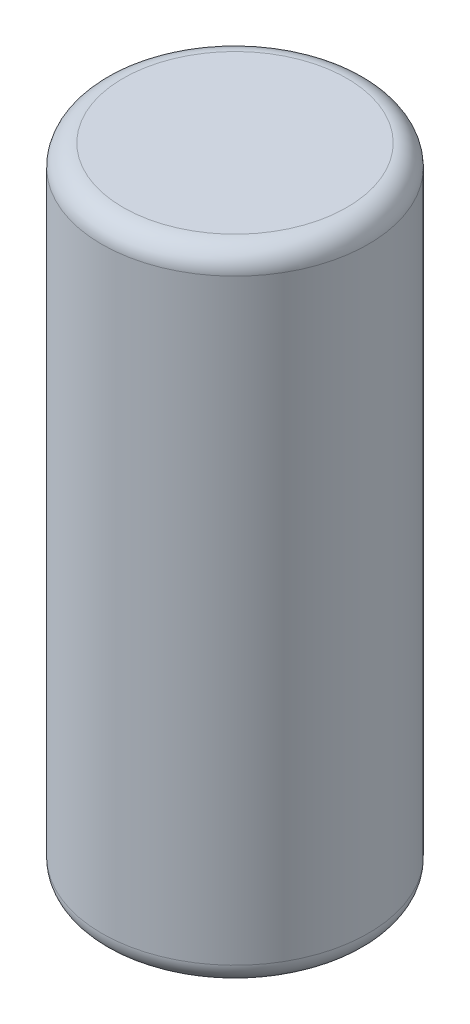
ISO-10303-21;
HEADER;
FILE_DESCRIPTION(('STEP AP214'),'2;1');
FILE_NAME('part.step','',(''),(''),'','','');
FILE_SCHEMA(('AUTOMOTIVE_DESIGN { 1 0 10303 214 1 1 1 1 }'));
ENDSEC;
DATA;
#1=APPLICATION_CONTEXT('core data for automotive mechanical design processes');
#2=APPLICATION_PROTOCOL_DEFINITION('international standard','automotive_design',2000,#1);
#3=PRODUCT_CONTEXT('',#1,'mechanical');
#4=PRODUCT('Part','Part','',(#3));
#5=PRODUCT_RELATED_PRODUCT_CATEGORY('part','',(#4));
#6=PRODUCT_DEFINITION_FORMATION('','',#4);
#7=PRODUCT_DEFINITION_CONTEXT('part definition',#1,'design');
#8=PRODUCT_DEFINITION('design','',#6,#7);
#9=PRODUCT_DEFINITION_SHAPE('','',#8);
#10=(LENGTH_UNIT() NAMED_UNIT(*) SI_UNIT(.MILLI.,.METRE.));
#11=(NAMED_UNIT(*) PLANE_ANGLE_UNIT() SI_UNIT($,.RADIAN.));
#12=(NAMED_UNIT(*) SI_UNIT($,.STERADIAN.) SOLID_ANGLE_UNIT());
#13=UNCERTAINTY_MEASURE_WITH_UNIT(LENGTH_MEASURE(1.E-05),#10,'distance_accuracy_value','');
#14=(GEOMETRIC_REPRESENTATION_CONTEXT(3) GLOBAL_UNCERTAINTY_ASSIGNED_CONTEXT((#13)) GLOBAL_UNIT_ASSIGNED_CONTEXT((#10,
#11,#12)) REPRESENTATION_CONTEXT('',''));
#15=CARTESIAN_POINT('',(0.,0.,0.));
#16=DIRECTION('',(0.,0.,1.));
#17=DIRECTION('',(1.,0.,0.));
#18=AXIS2_PLACEMENT_3D('',#15,#16,#17);
#19=CARTESIAN_POINT('',(0.,300.,0.));
#20=DIRECTION('',(0.,-1.,0.));
#21=DIRECTION('',(0.,0.,-1.));
#22=AXIS2_PLACEMENT_3D('',#19,#20,#21);
#23=CYLINDRICAL_SURFACE('',#22,62.5);
#24=CARTESIAN_POINT('',(0.,10.,0.));
#25=DIRECTION('',(0.,1.,0.));
#26=DIRECTION('',(0.,0.,1.));
#27=AXIS2_PLACEMENT_3D('',#24,#25,#26);
#28=CIRCLE('',#27,62.5);
#29=CARTESIAN_POINT('',(0.,10.,62.5));
#30=VERTEX_POINT('',#29);
#31=EDGE_CURVE('E50',#30,#30,#28,.T.);
#32=ORIENTED_EDGE('',*,*,#31,.T.);
#33=EDGE_LOOP('',(#32));
#34=FACE_BOUND('',#33,.T.);
#35=CARTESIAN_POINT('',(0.,290.,0.));
#36=DIRECTION('',(0.,1.,0.));
#37=DIRECTION('',(0.,0.,1.));
#38=AXIS2_PLACEMENT_3D('',#35,#36,#37);
#39=CIRCLE('',#38,62.5);
#40=CARTESIAN_POINT('',(0.,290.,62.5));
#41=VERTEX_POINT('',#40);
#42=EDGE_CURVE('E55',#41,#41,#39,.F.);
#43=ORIENTED_EDGE('',*,*,#42,.T.);
#44=EDGE_LOOP('',(#43));
#45=FACE_BOUND('',#44,.T.);
#46=ADVANCED_FACE('F37',(#34,#45),#23,.T.);
#47=CARTESIAN_POINT('',(0.,300.,0.));
#48=DIRECTION('',(0.,1.,0.));
#49=DIRECTION('',(0.,0.,1.));
#50=AXIS2_PLACEMENT_3D('',#47,#48,#49);
#51=PLANE('',#50);
#52=CARTESIAN_POINT('',(0.,300.,0.));
#53=DIRECTION('',(0.,1.,0.));
#54=DIRECTION('',(0.,0.,1.));
#55=AXIS2_PLACEMENT_3D('',#52,#53,#54);
#56=CIRCLE('',#55,52.5);
#57=CARTESIAN_POINT('',(0.,300.,52.5));
#58=VERTEX_POINT('',#57);
#59=EDGE_CURVE('E10',#58,#58,#56,.T.);
#60=ORIENTED_EDGE('',*,*,#59,.T.);
#61=EDGE_LOOP('',(#60));
#62=FACE_BOUND('',#61,.T.);
#63=ADVANCED_FACE('F72',(#62),#51,.T.);
#64=CARTESIAN_POINT('',(0.,0.,0.));
#65=DIRECTION('',(0.,1.,0.));
#66=DIRECTION('',(0.,0.,1.));
#67=AXIS2_PLACEMENT_3D('',#64,#65,#66);
#68=PLANE('',#67);
#69=CARTESIAN_POINT('',(0.,0.,0.));
#70=DIRECTION('',(0.,1.,0.));
#71=DIRECTION('',(0.,0.,1.));
#72=AXIS2_PLACEMENT_3D('',#69,#70,#71);
#73=CIRCLE('',#72,52.5);
#74=CARTESIAN_POINT('',(0.,0.,52.5));
#75=VERTEX_POINT('',#74);
#76=EDGE_CURVE('E45',#75,#75,#73,.F.);
#77=ORIENTED_EDGE('',*,*,#76,.T.);
#78=EDGE_LOOP('',(#77));
#79=FACE_BOUND('',#78,.T.);
#80=ADVANCED_FACE('F69',(#79),#68,.F.);
#81=CARTESIAN_POINT('',(0.,10.,0.));
#82=DIRECTION('',(0.,1.,0.));
#83=DIRECTION('',(0.,0.,1.));
#84=AXIS2_PLACEMENT_3D('',#81,#82,#83);
#85=TOROIDAL_SURFACE('',#84,52.5,10.);
#86=ORIENTED_EDGE('',*,*,#76,.F.);
#87=EDGE_LOOP('',(#86));
#88=FACE_BOUND('',#87,.T.);
#89=ORIENTED_EDGE('',*,*,#31,.F.);
#90=EDGE_LOOP('',(#89));
#91=FACE_BOUND('',#90,.T.);
#92=ADVANCED_FACE('F65',(#88,#91),#85,.T.);
#93=CARTESIAN_POINT('',(0.,290.,0.));
#94=DIRECTION('',(0.,1.,0.));
#95=DIRECTION('',(0.,0.,1.));
#96=AXIS2_PLACEMENT_3D('',#93,#94,#95);
#97=TOROIDAL_SURFACE('',#96,52.5,10.);
#98=ORIENTED_EDGE('',*,*,#42,.F.);
#99=EDGE_LOOP('',(#98));
#100=FACE_BOUND('',#99,.T.);
#101=ORIENTED_EDGE('',*,*,#59,.F.);
#102=EDGE_LOOP('',(#101));
#103=FACE_BOUND('',#102,.T.);
#104=ADVANCED_FACE('F39',(#100,#103),#97,.T.);
#105=CLOSED_SHELL('',(#46,#63,#80,#92,#104));
#106=MANIFOLD_SOLID_BREP('B2',#105);
#107=ADVANCED_BREP_SHAPE_REPRESENTATION('',(#18,#106),#14);
#108=SHAPE_DEFINITION_REPRESENTATION(#9,#107);
ENDSEC;
END-ISO-10303-21;
